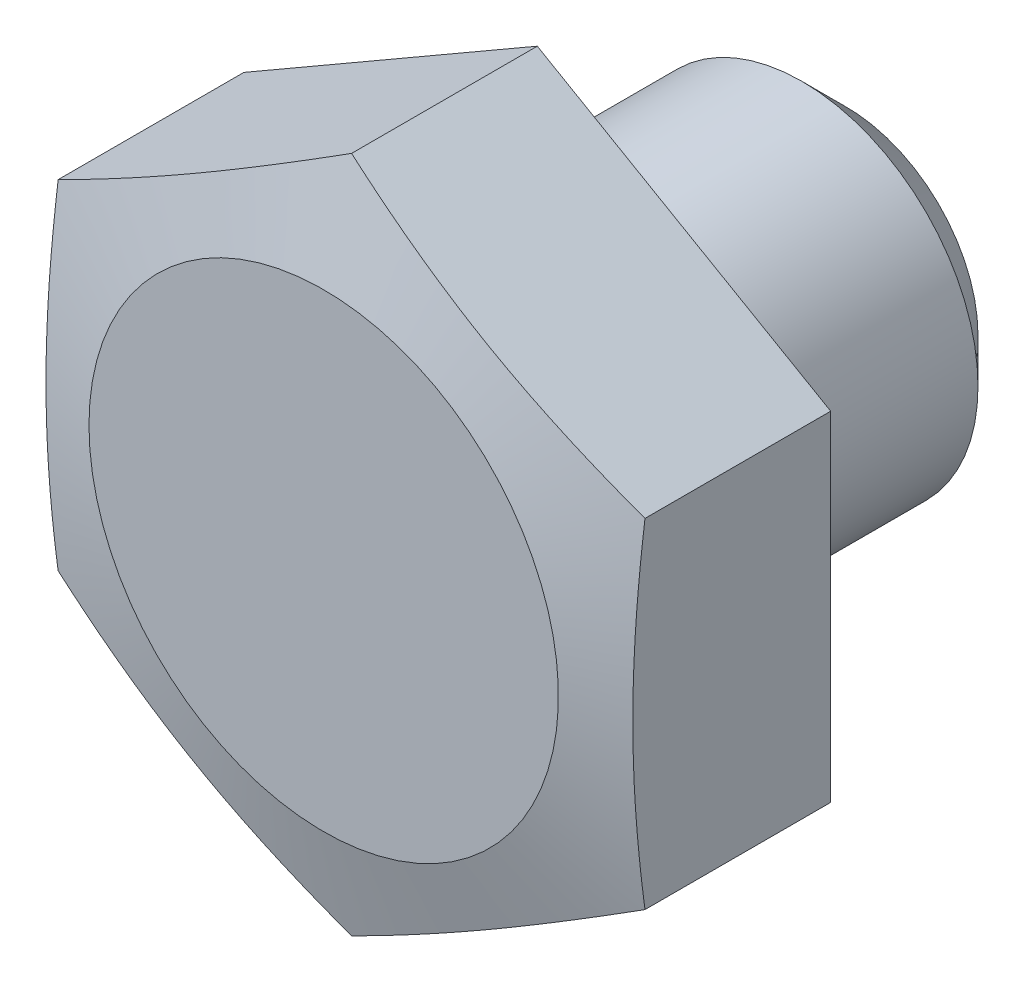
ISO-10303-21;
HEADER;
FILE_DESCRIPTION(('STEP AP214'),'2;1');
FILE_NAME('part.step','',(''),(''),'','','');
FILE_SCHEMA(('AUTOMOTIVE_DESIGN { 1 0 10303 214 1 1 1 1 }'));
ENDSEC;
DATA;
#1=APPLICATION_CONTEXT('core data for automotive mechanical design processes');
#2=APPLICATION_PROTOCOL_DEFINITION('international standard','automotive_design',2000,#1);
#3=PRODUCT_CONTEXT('',#1,'mechanical');
#4=PRODUCT('Part','Part','',(#3));
#5=PRODUCT_RELATED_PRODUCT_CATEGORY('part','',(#4));
#6=PRODUCT_DEFINITION_FORMATION('','',#4);
#7=PRODUCT_DEFINITION_CONTEXT('part definition',#1,'design');
#8=PRODUCT_DEFINITION('design','',#6,#7);
#9=PRODUCT_DEFINITION_SHAPE('','',#8);
#10=(LENGTH_UNIT() NAMED_UNIT(*) SI_UNIT(.MILLI.,.METRE.));
#11=(NAMED_UNIT(*) PLANE_ANGLE_UNIT() SI_UNIT($,.RADIAN.));
#12=(NAMED_UNIT(*) SI_UNIT($,.STERADIAN.) SOLID_ANGLE_UNIT());
#13=UNCERTAINTY_MEASURE_WITH_UNIT(LENGTH_MEASURE(1.E-05),#10,'distance_accuracy_value','');
#14=(GEOMETRIC_REPRESENTATION_CONTEXT(3) GLOBAL_UNCERTAINTY_ASSIGNED_CONTEXT((#13)) GLOBAL_UNIT_ASSIGNED_CONTEXT((#10,
#11,#12)) REPRESENTATION_CONTEXT('',''));
#15=CARTESIAN_POINT('',(0.,0.,0.));
#16=DIRECTION('',(0.,0.,1.));
#17=DIRECTION('',(1.,0.,0.));
#18=AXIS2_PLACEMENT_3D('',#15,#16,#17);
#19=CARTESIAN_POINT('',(0.,0.,0.));
#20=DIRECTION('',(0.,0.,1.));
#21=DIRECTION('',(1.,0.,0.));
#22=AXIS2_PLACEMENT_3D('',#19,#20,#21);
#23=PLANE('',#22);
#24=CARTESIAN_POINT('',(0.,0.,0.));
#25=DIRECTION('',(0.,0.,1.));
#26=DIRECTION('',(1.,0.,0.));
#27=AXIS2_PLACEMENT_3D('',#24,#25,#26);
#28=CIRCLE('',#27,3.1);
#29=CARTESIAN_POINT('',(3.1,0.,0.));
#30=VERTEX_POINT('',#29);
#31=EDGE_CURVE('E66',#30,#30,#28,.T.);
#32=ORIENTED_EDGE('',*,*,#31,.T.);
#33=EDGE_LOOP('',(#32));
#34=FACE_BOUND('',#33,.T.);
#35=CARTESIAN_POINT('',(0.,0.,0.));
#36=DIRECTION('',(0.,0.,1.));
#37=DIRECTION('',(1.,0.,0.));
#38=AXIS2_PLACEMENT_3D('',#35,#36,#37);
#39=CIRCLE('',#38,4.5);
#40=CARTESIAN_POINT('',(4.5,0.,0.));
#41=VERTEX_POINT('',#40);
#42=EDGE_CURVE('E362',#41,#41,#39,.T.);
#43=ORIENTED_EDGE('',*,*,#42,.F.);
#44=EDGE_LOOP('',(#43));
#45=FACE_BOUND('',#44,.T.);
#46=ADVANCED_FACE('F58',(#34,#45),#23,.F.);
#47=CARTESIAN_POINT('',(0.,0.,-5.));
#48=DIRECTION('',(0.,0.,1.));
#49=DIRECTION('',(1.,0.,0.));
#50=AXIS2_PLACEMENT_3D('',#47,#48,#49);
#51=CYLINDRICAL_SURFACE('',#50,3.);
#52=CARTESIAN_POINT('',(0.,0.,-0.1));
#53=DIRECTION('',(0.,0.,1.));
#54=DIRECTION('',(1.,0.,0.));
#55=AXIS2_PLACEMENT_3D('',#52,#53,#54);
#56=CIRCLE('',#55,3.);
#57=CARTESIAN_POINT('',(3.,0.,-0.1));
#58=VERTEX_POINT('',#57);
#59=EDGE_CURVE('E13',#58,#58,#56,.F.);
#60=ORIENTED_EDGE('',*,*,#59,.T.);
#61=EDGE_LOOP('',(#60));
#62=FACE_BOUND('',#61,.T.);
#63=CARTESIAN_POINT('',(0.,0.,-4.24999999999999));
#64=DIRECTION('',(0.,0.,1.));
#65=DIRECTION('',(1.,0.,0.));
#66=AXIS2_PLACEMENT_3D('',#63,#64,#65);
#67=CIRCLE('',#66,3.);
#68=CARTESIAN_POINT('',(3.,0.,-4.24999999999999));
#69=VERTEX_POINT('',#68);
#70=EDGE_CURVE('E147',#69,#69,#67,.T.);
#71=ORIENTED_EDGE('',*,*,#70,.T.);
#72=EDGE_LOOP('',(#71));
#73=FACE_BOUND('',#72,.T.);
#74=ADVANCED_FACE('F168',(#62,#73),#51,.T.);
#75=CARTESIAN_POINT('',(0.,0.,-5.));
#76=DIRECTION('',(0.,0.,1.));
#77=DIRECTION('',(1.,0.,0.));
#78=AXIS2_PLACEMENT_3D('',#75,#76,#77);
#79=PLANE('',#78);
#80=CARTESIAN_POINT('',(0.,0.,-5.));
#81=DIRECTION('',(0.,0.,1.));
#82=DIRECTION('',(1.,0.,0.));
#83=AXIS2_PLACEMENT_3D('',#80,#81,#82);
#84=CIRCLE('',#83,2.24999999999999);
#85=CARTESIAN_POINT('',(2.24999999999999,0.,-5.));
#86=VERTEX_POINT('',#85);
#87=EDGE_CURVE('E117',#86,#86,#84,.F.);
#88=ORIENTED_EDGE('',*,*,#87,.T.);
#89=EDGE_LOOP('',(#88));
#90=FACE_BOUND('',#89,.T.);
#91=ADVANCED_FACE('F173',(#90),#79,.F.);
#92=CARTESIAN_POINT('',(0.,0.,-4.24999999999999));
#93=DIRECTION('',(0.,0.,1.));
#94=DIRECTION('',(1.,0.,0.));
#95=AXIS2_PLACEMENT_3D('',#92,#93,#94);
#96=CONICAL_SURFACE('',#95,3.,0.785398163397454);
#97=ORIENTED_EDGE('',*,*,#87,.F.);
#98=EDGE_LOOP('',(#97));
#99=FACE_BOUND('',#98,.T.);
#100=ORIENTED_EDGE('',*,*,#70,.F.);
#101=EDGE_LOOP('',(#100));
#102=FACE_BOUND('',#101,.T.);
#103=ADVANCED_FACE('F241',(#99,#102),#96,.T.);
#104=CARTESIAN_POINT('',(0.,0.,0.26));
#105=DIRECTION('',(0.,0.,1.));
#106=DIRECTION('',(1.,0.,0.));
#107=AXIS2_PLACEMENT_3D('',#104,#105,#106);
#108=PLANE('',#107);
#109=CARTESIAN_POINT('',(0.,0.,0.26));
#110=DIRECTION('',(0.,0.,1.));
#111=DIRECTION('',(1.,0.,0.));
#112=AXIS2_PLACEMENT_3D('',#109,#110,#111);
#113=CIRCLE('',#112,4.5);
#114=CARTESIAN_POINT('',(4.5,0.,0.26));
#115=VERTEX_POINT('',#114);
#116=EDGE_CURVE('E127',#115,#115,#113,.T.);
#117=ORIENTED_EDGE('',*,*,#116,.T.);
#118=EDGE_LOOP('',(#117));
#119=FACE_BOUND('',#118,.T.);
#120=DIRECTION('',(0.,1.,0.));
#121=VECTOR('',#120,1.);
#122=CARTESIAN_POINT('',(5.,-2.88675134594813,0.26));
#123=LINE('',#122,#121);
#124=CARTESIAN_POINT('',(5.,-2.88675134594813,0.26));
#125=VERTEX_POINT('',#124);
#126=CARTESIAN_POINT('',(5.,2.88675134594813,0.26));
#127=VERTEX_POINT('',#126);
#128=EDGE_CURVE('E108',#125,#127,#123,.T.);
#129=ORIENTED_EDGE('',*,*,#128,.F.);
#130=DIRECTION('',(0.866025403784439,0.5,0.));
#131=VECTOR('',#130,1.);
#132=CARTESIAN_POINT('',(0.,-5.77350269189626,0.26));
#133=LINE('',#132,#131);
#134=CARTESIAN_POINT('',(0.,-5.77350269189626,0.26));
#135=VERTEX_POINT('',#134);
#136=EDGE_CURVE('E111',#135,#125,#133,.T.);
#137=ORIENTED_EDGE('',*,*,#136,.F.);
#138=DIRECTION('',(0.866025403784439,-0.5,0.));
#139=VECTOR('',#138,1.);
#140=CARTESIAN_POINT('',(-5.,-2.88675134594813,0.26));
#141=LINE('',#140,#139);
#142=CARTESIAN_POINT('',(-5.,-2.88675134594813,0.26));
#143=VERTEX_POINT('',#142);
#144=EDGE_CURVE('E126',#143,#135,#141,.T.);
#145=ORIENTED_EDGE('',*,*,#144,.F.);
#146=DIRECTION('',(0.,-1.,0.));
#147=VECTOR('',#146,1.);
#148=CARTESIAN_POINT('',(-5.,2.88675134594813,0.26));
#149=LINE('',#148,#147);
#150=CARTESIAN_POINT('',(-5.,2.88675134594813,0.26));
#151=VERTEX_POINT('',#150);
#152=EDGE_CURVE('E354',#151,#143,#149,.T.);
#153=ORIENTED_EDGE('',*,*,#152,.F.);
#154=DIRECTION('',(-0.866025403784439,-0.5,0.));
#155=VECTOR('',#154,1.);
#156=CARTESIAN_POINT('',(0.,5.77350269189626,0.26));
#157=LINE('',#156,#155);
#158=CARTESIAN_POINT('',(0.,5.77350269189626,0.26));
#159=VERTEX_POINT('',#158);
#160=EDGE_CURVE('E357',#159,#151,#157,.T.);
#161=ORIENTED_EDGE('',*,*,#160,.F.);
#162=DIRECTION('',(-0.866025403784439,0.5,0.));
#163=VECTOR('',#162,1.);
#164=CARTESIAN_POINT('',(5.,2.88675134594813,0.26));
#165=LINE('',#164,#163);
#166=EDGE_CURVE('E73',#127,#159,#165,.T.);
#167=ORIENTED_EDGE('',*,*,#166,.F.);
#168=EDGE_LOOP('',(#129,#137,#145,#153,#161,#167));
#169=FACE_BOUND('',#168,.T.);
#170=ADVANCED_FACE('F110',(#119,#169),#108,.F.);
#171=CARTESIAN_POINT('',(0.,0.,0.26));
#172=DIRECTION('',(0.,0.,-1.));
#173=DIRECTION('',(-1.,0.,0.));
#174=AXIS2_PLACEMENT_3D('',#171,#172,#173);
#175=CYLINDRICAL_SURFACE('',#174,4.5);
#176=ORIENTED_EDGE('',*,*,#116,.F.);
#177=EDGE_LOOP('',(#176));
#178=FACE_BOUND('',#177,.T.);
#179=ORIENTED_EDGE('',*,*,#42,.T.);
#180=EDGE_LOOP('',(#179));
#181=FACE_BOUND('',#180,.T.);
#182=ADVANCED_FACE('F248',(#178,#181),#175,.T.);
#183=CARTESIAN_POINT('',(0.,0.,3.9));
#184=DIRECTION('',(0.,0.,1.));
#185=DIRECTION('',(1.,0.,0.));
#186=AXIS2_PLACEMENT_3D('',#183,#184,#185);
#187=PLANE('',#186);
#188=CARTESIAN_POINT('',(0.,0.,3.9));
#189=DIRECTION('',(0.,0.,-1.));
#190=DIRECTION('',(-1.,0.,0.));
#191=AXIS2_PLACEMENT_3D('',#188,#189,#190);
#192=CIRCLE('',#191,4.);
#193=CARTESIAN_POINT('',(-4.,0.,3.9));
#194=VERTEX_POINT('',#193);
#195=EDGE_CURVE('E193',#194,#194,#192,.T.);
#196=ORIENTED_EDGE('',*,*,#195,.F.);
#197=EDGE_LOOP('',(#196));
#198=FACE_BOUND('',#197,.T.);
#199=ADVANCED_FACE('F178',(#198),#187,.T.);
#200=CARTESIAN_POINT('',(0.,0.,3.9));
#201=DIRECTION('',(0.,0.,-1.));
#202=DIRECTION('',(-1.,0.,0.));
#203=AXIS2_PLACEMENT_3D('',#200,#201,#202);
#204=CONICAL_SURFACE('',#203,4.,1.30899693899575);
#205=ORIENTED_EDGE('',*,*,#195,.T.);
#206=EDGE_LOOP('',(#205));
#207=FACE_BOUND('',#206,.T.);
#208=CARTESIAN_POINT('',(-5.0002,2.88663587589429,3.42476044489613));
#209=CARTESIAN_POINT('',(-4.79254599569434,3.00652497117847,3.45689871138588));
#210=CARTESIAN_POINT('',(-4.58451548167429,3.1266314444476,3.48607499454545));
#211=CARTESIAN_POINT('',(-4.16771975103018,3.36726857173206,3.53733503738883));
#212=CARTESIAN_POINT('',(-3.95895427067026,3.48779937801537,3.55941591599972));
#213=CARTESIAN_POINT('',(-3.54195440146031,3.72855436475577,3.59519603972269));
#214=CARTESIAN_POINT('',(-3.33372283258692,3.8487769170986,3.6089379557021));
#215=CARTESIAN_POINT('',(-2.91699413634292,4.08937534205412,3.62736446336494));
#216=CARTESIAN_POINT('',(-2.70849706817146,4.20975118048816,3.63205080756888));
#217=CARTESIAN_POINT('',(-2.29150293182854,4.45050285735623,3.63205080756888));
#218=CARTESIAN_POINT('',(-2.08300586365708,4.57087869579027,3.62736446336494));
#219=CARTESIAN_POINT('',(-1.66627716741308,4.81147712074579,3.6089379557021));
#220=CARTESIAN_POINT('',(-1.45804559853969,4.93169967308862,3.59519603972269));
#221=CARTESIAN_POINT('',(-1.04104572932974,5.17245465982902,3.55941591599972));
#222=CARTESIAN_POINT('',(-0.832280248969818,5.29298546611233,3.53733503738883));
#223=CARTESIAN_POINT('',(-0.415484518325708,5.53362259339679,3.48607499454545));
#224=CARTESIAN_POINT('',(-0.207454004305664,5.65372906666592,3.45689871138588));
#225=CARTESIAN_POINT('',(0.000200000000000952,5.7736181619501,3.42476044489613));
#226=B_SPLINE_CURVE_WITH_KNOTS('',3,(#208,#209,#210,#211,#212,#213,#214,#215,#216,#217,#218,
#219,#220,#221,#222,#223,#224,#225),.UNSPECIFIED.,.F.,.F.,(4,2,2,2,2,2,2,2,4),(0.,
0.725805237679808,1.45190481561532,2.17425686883392,2.89646911159516,3.6186813543564,
4.34103340757501,5.06713298551051,5.79293822319032),.UNSPECIFIED.);
#227=CARTESIAN_POINT('',(-5.,2.88675134594813,3.42479138593199));
#228=VERTEX_POINT('',#227);
#229=CARTESIAN_POINT('',(0.,5.77350269189626,3.42479138593199));
#230=VERTEX_POINT('',#229);
#231=EDGE_CURVE('E224',#228,#230,#226,.T.);
#232=ORIENTED_EDGE('',*,*,#231,.F.);
#233=CARTESIAN_POINT('',(-5.,-7.71938857293575,2.50740758007849));
#234=CARTESIAN_POINT('',(-5.,-7.49147427168933,2.5586506711407));
#235=CARTESIAN_POINT('',(-5.,-7.26341962327938,2.60928049818289));
#236=CARTESIAN_POINT('',(-5.,-6.80696046487182,2.70898221683248));
#237=CARTESIAN_POINT('',(-5.,-6.57855594068918,2.75805404342194));
#238=CARTESIAN_POINT('',(-5.,-6.12114081846093,2.85434740009249));
#239=CARTESIAN_POINT('',(-5.,-5.89212985971082,2.9015672227117));
#240=CARTESIAN_POINT('',(-5.,-5.43363694023774,2.99366077539556));
#241=CARTESIAN_POINT('',(-5.,-5.20415498336043,3.03853452453708));
#242=CARTESIAN_POINT('',(-5.,-4.74669561473332,3.12498601768013));
#243=CARTESIAN_POINT('',(-5.,-4.51872312275535,3.16658966965695));
#244=CARTESIAN_POINT('',(-5.,-4.06216118292291,3.24625518987446));
#245=CARTESIAN_POINT('',(-5.,-3.83357174836871,3.28431713385075));
#246=CARTESIAN_POINT('',(-5.,-3.37571675111581,3.35606117758773));
#247=CARTESIAN_POINT('',(-5.,-3.14645123580777,3.38974357720939));
#248=CARTESIAN_POINT('',(-5.,-2.68718848722816,3.45175097196975));
#249=CARTESIAN_POINT('',(-5.,-2.45719125269116,3.48007595783829));
#250=CARTESIAN_POINT('',(-5.,-1.99381235919122,3.53058841201233));
#251=CARTESIAN_POINT('',(-5.,-1.76042239852366,3.55270084172098));
#252=CARTESIAN_POINT('',(-5.,-1.29303834898082,3.58927121142274));
#253=CARTESIAN_POINT('',(-5.,-1.05904427428246,3.60372932943009));
#254=CARTESIAN_POINT('',(-5.,-0.590803464055625,3.62414927679565));
#255=CARTESIAN_POINT('',(-5.,-0.356556930570833,3.63011564576264));
#256=CARTESIAN_POINT('',(-5.,0.1119950018632,3.63318477990246));
#257=CARTESIAN_POINT('',(-5.,0.346300400708154,3.63028756066898));
#258=CARTESIAN_POINT('',(-5.,0.815702332550344,3.6157848044719));
#259=CARTESIAN_POINT('',(-5.,1.05079761908674,3.60413973435184));
#260=CARTESIAN_POINT('',(-5.,1.52045390424001,3.57280431062971));
#261=CARTESIAN_POINT('',(-5.,1.7550148730958,3.55311351939736));
#262=CARTESIAN_POINT('',(-5.,2.22359969488492,3.50670213839425));
#263=CARTESIAN_POINT('',(-5.,2.45762304038479,3.47997650447177));
#264=CARTESIAN_POINT('',(-5.,2.92491072170449,3.42063342174126));
#265=CARTESIAN_POINT('',(-5.,3.15817506053191,3.38801599630868));
#266=CARTESIAN_POINT('',(-5.,3.67089843043664,3.31090516163662));
#267=CARTESIAN_POINT('',(-5.,3.95019552214342,3.2653430589873));
#268=CARTESIAN_POINT('',(-5.,4.5078641671335,3.16884457136917));
#269=CARTESIAN_POINT('',(-5.,4.78623567003497,3.11790789863514));
#270=CARTESIAN_POINT('',(-5.,5.34224429024145,3.01189120228595));
#271=CARTESIAN_POINT('',(-5.,5.61988124068023,2.95681030902665));
#272=CARTESIAN_POINT('',(-5.,6.1744943954023,2.84345950223111));
#273=CARTESIAN_POINT('',(-5.,6.4514706124489,2.78518965082479));
#274=CARTESIAN_POINT('',(-5.,7.0050486624742,2.66613430078371));
#275=CARTESIAN_POINT('',(-5.,7.28165018383369,2.60534735809867));
#276=CARTESIAN_POINT('',(-5.,7.83441649328104,2.4818160373549));
#277=CARTESIAN_POINT('',(-5.,8.11058127842605,2.41907164616488));
#278=CARTESIAN_POINT('',(-5.,8.93847178761893,2.2285435952327));
#279=CARTESIAN_POINT('',(-5.,9.48966522946674,2.09844942786497));
#280=CARTESIAN_POINT('',(-5.,10.5827319287434,1.83626115900039));
#281=CARTESIAN_POINT('',(-5.,11.1246197407943,1.70422732451607));
#282=CARTESIAN_POINT('',(-5.,12.2077528662115,1.43746864765053));
#283=CARTESIAN_POINT('',(-5.,12.7489981551808,1.30274370634371));
#284=CARTESIAN_POINT('',(-5.,13.8299959758578,1.03164505898908));
#285=CARTESIAN_POINT('',(-5.,14.3697494036634,0.895274918043513));
#286=CARTESIAN_POINT('',(-5.,15.4488678627502,0.621114449919813));
#287=CARTESIAN_POINT('',(-5.,15.9882329115673,0.483324191805858));
#288=CARTESIAN_POINT('',(-5.,16.5274739773435,0.34505516170082));
#289=B_SPLINE_CURVE_WITH_KNOTS('',3,(#233,#234,#235,#236,#237,#238,#239,#240,#241,#242,#243,
#244,#245,#246,#247,#248,#249,#250,#251,#252,#253,#254,#255,#256,#257,#258,#259,#260,#261,#262,
#263,#264,#265,#266,#267,#268,#269,#270,#271,#272,#273,#274,#275,#276,#277,#278,#279,#280,#281,
#282,#283,#284,#285,#286,#287,#288),.UNSPECIFIED.,.F.,.F.,(4,2,2,2,2,2,2,2,2,2,2,2,2,2,2,2,2,2,
2,2,2,2,2,2,2,2,2,4),(0.,0.700814460777488,1.40165812936402,2.10313344179458,2.80460304935615,
3.49979359532529,4.19496927197792,4.89009732587981,5.58522658257885,6.28842261062312,
6.99160228390911,7.6944059026078,8.39720828486562,9.10320601298499,9.80924214749582,
10.5157859125011,11.2223268743828,12.0712227288488,12.9201640579817,13.7692840327893,
14.6183874702216,15.4679849751964,16.3175881808191,18.0165748535255,19.6897908742068,
21.3630685162348,23.0332087424935,24.7032681249786),.UNSPECIFIED.);
#290=CARTESIAN_POINT('',(-5.,-2.88675134594813,3.42479138593199));
#291=VERTEX_POINT('',#290);
#292=EDGE_CURVE('E217',#291,#228,#289,.T.);
#293=ORIENTED_EDGE('',*,*,#292,.F.);
#294=CARTESIAN_POINT('',(0.000200000000000598,-5.7736181619501,3.42476044489613));
#295=CARTESIAN_POINT('',(-0.207454004305664,-5.65372906666592,3.45689871138588));
#296=CARTESIAN_POINT('',(-0.415484518325707,-5.53362259339679,3.48607499454545));
#297=CARTESIAN_POINT('',(-0.832280248969817,-5.29298546611233,3.53733503738883));
#298=CARTESIAN_POINT('',(-1.04104572932974,-5.17245465982902,3.55941591599972));
#299=CARTESIAN_POINT('',(-1.45804559853969,-4.93169967308862,3.59519603972269));
#300=CARTESIAN_POINT('',(-1.66627716741308,-4.81147712074579,3.6089379557021));
#301=CARTESIAN_POINT('',(-2.08300586365708,-4.57087869579027,3.62736446336494));
#302=CARTESIAN_POINT('',(-2.29150293182854,-4.45050285735623,3.63205080756888));
#303=CARTESIAN_POINT('',(-2.70849706817146,-4.20975118048815,3.63205080756888));
#304=CARTESIAN_POINT('',(-2.91699413634292,-4.08937534205412,3.62736446336494));
#305=CARTESIAN_POINT('',(-3.33372283258692,-3.8487769170986,3.6089379557021));
#306=CARTESIAN_POINT('',(-3.54195440146031,-3.72855436475577,3.59519603972269));
#307=CARTESIAN_POINT('',(-3.95895427067026,-3.48779937801536,3.55941591599972));
#308=CARTESIAN_POINT('',(-4.16771975103018,-3.36726857173206,3.53733503738883));
#309=CARTESIAN_POINT('',(-4.58451548167429,-3.1266314444476,3.48607499454545));
#310=CARTESIAN_POINT('',(-4.79254599569433,-3.00652497117847,3.45689871138588));
#311=CARTESIAN_POINT('',(-5.0002,-2.88663587589429,3.42476044489613));
#312=B_SPLINE_CURVE_WITH_KNOTS('',3,(#294,#295,#296,#297,#298,#299,#300,#301,#302,#303,#304,
#305,#306,#307,#308,#309,#310,#311),.UNSPECIFIED.,.F.,.F.,(4,2,2,2,2,2,2,2,4),(0.,
0.725805237679808,1.45190481561532,2.17425686883392,2.89646911159516,3.6186813543564,
4.34103340757501,5.06713298551051,5.79293822319032),.UNSPECIFIED.);
#313=CARTESIAN_POINT('',(0.,-5.77350269189626,3.42479138593199));
#314=VERTEX_POINT('',#313);
#315=EDGE_CURVE('E211',#314,#291,#312,.T.);
#316=ORIENTED_EDGE('',*,*,#315,.F.);
#317=CARTESIAN_POINT('',(5.0002,-2.88663587589429,3.42476044489613));
#318=CARTESIAN_POINT('',(4.79254599569433,-3.00652497117847,3.45689871138588));
#319=CARTESIAN_POINT('',(4.58451548167429,-3.1266314444476,3.48607499454545));
#320=CARTESIAN_POINT('',(4.16771975103018,-3.36726857173207,3.53733503738883));
#321=CARTESIAN_POINT('',(3.95895427067026,-3.48779937801537,3.55941591599972));
#322=CARTESIAN_POINT('',(3.54195440146031,-3.72855436475577,3.59519603972269));
#323=CARTESIAN_POINT('',(3.33372283258692,-3.8487769170986,3.6089379557021));
#324=CARTESIAN_POINT('',(2.91699413634291,-4.08937534205412,3.62736446336494));
#325=CARTESIAN_POINT('',(2.70849706817146,-4.20975118048816,3.63205080756888));
#326=CARTESIAN_POINT('',(2.29150293182854,-4.45050285735624,3.63205080756888));
#327=CARTESIAN_POINT('',(2.08300586365709,-4.57087869579027,3.62736446336494));
#328=CARTESIAN_POINT('',(1.66627716741308,-4.81147712074579,3.6089379557021));
#329=CARTESIAN_POINT('',(1.45804559853969,-4.93169967308862,3.59519603972269));
#330=CARTESIAN_POINT('',(1.04104572932974,-5.17245465982903,3.55941591599972));
#331=CARTESIAN_POINT('',(0.832280248969819,-5.29298546611233,3.53733503738883));
#332=CARTESIAN_POINT('',(0.415484518325708,-5.53362259339679,3.48607499454545));
#333=CARTESIAN_POINT('',(0.207454004305665,-5.65372906666592,3.45689871138588));
#334=CARTESIAN_POINT('',(-0.000199999999999693,-5.7736181619501,3.42476044489613));
#335=B_SPLINE_CURVE_WITH_KNOTS('',3,(#317,#318,#319,#320,#321,#322,#323,#324,#325,#326,#327,
#328,#329,#330,#331,#332,#333,#334),.UNSPECIFIED.,.F.,.F.,(4,2,2,2,2,2,2,2,4),(0.,
0.725805237679808,1.45190481561532,2.17425686883392,2.89646911159516,3.6186813543564,
4.341033407575,5.06713298551051,5.79293822319032),.UNSPECIFIED.);
#336=CARTESIAN_POINT('',(5.,-2.88675134594813,3.42479138593199));
#337=VERTEX_POINT('',#336);
#338=EDGE_CURVE('E81',#337,#314,#335,.T.);
#339=ORIENTED_EDGE('',*,*,#338,.F.);
#340=CARTESIAN_POINT('',(5.,-7.71938857293575,2.50740758007849));
#341=CARTESIAN_POINT('',(5.,-7.49147427168934,2.5586506711407));
#342=CARTESIAN_POINT('',(5.,-7.26341962327938,2.60928049818289));
#343=CARTESIAN_POINT('',(5.,-6.80696046487183,2.70898221683248));
#344=CARTESIAN_POINT('',(5.,-6.57855594068919,2.75805404342194));
#345=CARTESIAN_POINT('',(5.,-6.12114081846093,2.85434740009249));
#346=CARTESIAN_POINT('',(5.,-5.89212985971083,2.9015672227117));
#347=CARTESIAN_POINT('',(5.,-5.43363694023775,2.99366077539556));
#348=CARTESIAN_POINT('',(5.,-5.20415498336043,3.03853452453708));
#349=CARTESIAN_POINT('',(5.,-4.74669561473333,3.12498601768013));
#350=CARTESIAN_POINT('',(5.,-4.51872312275535,3.16658966965695));
#351=CARTESIAN_POINT('',(5.,-4.06216118292291,3.24625518987446));
#352=CARTESIAN_POINT('',(5.,-3.83357174836871,3.28431713385075));
#353=CARTESIAN_POINT('',(5.,-3.37571675111582,3.35606117758773));
#354=CARTESIAN_POINT('',(5.,-3.14645123580777,3.38974357720939));
#355=CARTESIAN_POINT('',(5.,-2.68718848722816,3.45175097196975));
#356=CARTESIAN_POINT('',(5.,-2.45719125269117,3.48007595783829));
#357=CARTESIAN_POINT('',(5.,-1.99381235919123,3.53058841201233));
#358=CARTESIAN_POINT('',(5.,-1.76042239852366,3.55270084172098));
#359=CARTESIAN_POINT('',(5.,-1.29303834898083,3.58927121142274));
#360=CARTESIAN_POINT('',(5.,-1.05904427428246,3.6037293294301));
#361=CARTESIAN_POINT('',(5.,-0.59080346405563,3.62414927679565));
#362=CARTESIAN_POINT('',(5.,-0.356556930570837,3.63011564576264));
#363=CARTESIAN_POINT('',(5.,0.111995001863196,3.63318477990246));
#364=CARTESIAN_POINT('',(5.,0.34630040070815,3.63028756066898));
#365=CARTESIAN_POINT('',(5.,0.81570233255034,3.6157848044719));
#366=CARTESIAN_POINT('',(5.,1.05079761908674,3.60413973435184));
#367=CARTESIAN_POINT('',(5.,1.52045390424001,3.57280431062971));
#368=CARTESIAN_POINT('',(5.,1.75501487309579,3.55311351939736));
#369=CARTESIAN_POINT('',(5.,2.22359969488492,3.50670213839425));
#370=CARTESIAN_POINT('',(5.,2.45762304038479,3.47997650447177));
#371=CARTESIAN_POINT('',(5.,2.92491072170449,3.42063342174126));
#372=CARTESIAN_POINT('',(5.,3.15817506053191,3.38801599630868));
#373=CARTESIAN_POINT('',(5.,3.67089843043664,3.31090516163663));
#374=CARTESIAN_POINT('',(5.,3.95019552214341,3.2653430589873));
#375=CARTESIAN_POINT('',(5.,4.5078641671335,3.16884457136917));
#376=CARTESIAN_POINT('',(5.,4.78623567003497,3.11790789863514));
#377=CARTESIAN_POINT('',(5.,5.34224429024145,3.01189120228595));
#378=CARTESIAN_POINT('',(5.,5.61988124068023,2.95681030902665));
#379=CARTESIAN_POINT('',(5.,6.17449439540229,2.84345950223111));
#380=CARTESIAN_POINT('',(5.,6.45147061244889,2.78518965082479));
#381=CARTESIAN_POINT('',(5.,7.0050486624742,2.66613430078371));
#382=CARTESIAN_POINT('',(5.,7.28165018383368,2.60534735809867));
#383=CARTESIAN_POINT('',(5.,7.83441649328104,2.48181603735491));
#384=CARTESIAN_POINT('',(5.,8.11058127842605,2.41907164616488));
#385=CARTESIAN_POINT('',(5.,8.93847178761892,2.2285435952327));
#386=CARTESIAN_POINT('',(5.,9.48966522946674,2.09844942786497));
#387=CARTESIAN_POINT('',(5.,10.5827319287434,1.83626115900039));
#388=CARTESIAN_POINT('',(5.,11.1246197407943,1.70422732451607));
#389=CARTESIAN_POINT('',(5.,12.2077528662115,1.43746864765053));
#390=CARTESIAN_POINT('',(5.,12.7489981551808,1.30274370634371));
#391=CARTESIAN_POINT('',(5.,13.8299959758578,1.03164505898908));
#392=CARTESIAN_POINT('',(5.,14.3697494036634,0.895274918043512));
#393=CARTESIAN_POINT('',(5.,15.4488678627503,0.621114449919811));
#394=CARTESIAN_POINT('',(5.,15.9882329115673,0.483324191805856));
#395=CARTESIAN_POINT('',(5.,16.5274739773435,0.345055161700819));
#396=B_SPLINE_CURVE_WITH_KNOTS('',3,(#340,#341,#342,#343,#344,#345,#346,#347,#348,#349,#350,
#351,#352,#353,#354,#355,#356,#357,#358,#359,#360,#361,#362,#363,#364,#365,#366,#367,#368,#369,
#370,#371,#372,#373,#374,#375,#376,#377,#378,#379,#380,#381,#382,#383,#384,#385,#386,#387,#388,
#389,#390,#391,#392,#393,#394,#395),.UNSPECIFIED.,.F.,.F.,(4,2,2,2,2,2,2,2,2,2,2,2,2,2,2,2,2,2,
2,2,2,2,2,2,2,2,2,4),(0.,0.700814460777487,1.40165812936402,2.10313344179458,2.80460304935614,
3.49979359532529,4.19496927197792,4.89009732587981,5.58522658257885,6.28842261062312,
6.99160228390911,7.6944059026078,8.39720828486562,9.10320601298499,9.80924214749582,
10.5157859125011,11.2223268743828,12.0712227288488,12.9201640579817,13.7692840327893,
14.6183874702216,15.4679849751964,16.3175881808191,18.0165748535255,19.6897908742068,
21.3630685162348,23.0332087424935,24.7032681249786),.UNSPECIFIED.);
#397=CARTESIAN_POINT('',(5.,2.88675134594813,3.42479138593199));
#398=VERTEX_POINT('',#397);
#399=EDGE_CURVE('E130',#398,#337,#396,.F.);
#400=ORIENTED_EDGE('',*,*,#399,.F.);
#401=CARTESIAN_POINT('',(-0.000199999999999493,5.7736181619501,3.42476044489613));
#402=CARTESIAN_POINT('',(0.207454004305665,5.65372906666592,3.45689871138588));
#403=CARTESIAN_POINT('',(0.415484518325708,5.53362259339679,3.48607499454545));
#404=CARTESIAN_POINT('',(0.832280248969819,5.29298546611233,3.53733503738883));
#405=CARTESIAN_POINT('',(1.04104572932974,5.17245465982903,3.55941591599972));
#406=CARTESIAN_POINT('',(1.45804559853969,4.93169967308862,3.59519603972269));
#407=CARTESIAN_POINT('',(1.66627716741308,4.81147712074579,3.6089379557021));
#408=CARTESIAN_POINT('',(2.08300586365709,4.57087869579027,3.62736446336494));
#409=CARTESIAN_POINT('',(2.29150293182854,4.45050285735623,3.63205080756888));
#410=CARTESIAN_POINT('',(2.70849706817146,4.20975118048816,3.63205080756888));
#411=CARTESIAN_POINT('',(2.91699413634291,4.08937534205412,3.62736446336494));
#412=CARTESIAN_POINT('',(3.33372283258692,3.8487769170986,3.6089379557021));
#413=CARTESIAN_POINT('',(3.54195440146031,3.72855436475577,3.59519603972269));
#414=CARTESIAN_POINT('',(3.95895427067026,3.48779937801536,3.55941591599972));
#415=CARTESIAN_POINT('',(4.16771975103018,3.36726857173206,3.53733503738883));
#416=CARTESIAN_POINT('',(4.58451548167429,3.1266314444476,3.48607499454545));
#417=CARTESIAN_POINT('',(4.79254599569433,3.00652497117847,3.45689871138588));
#418=CARTESIAN_POINT('',(5.0002,2.88663587589429,3.42476044489613));
#419=B_SPLINE_CURVE_WITH_KNOTS('',3,(#401,#402,#403,#404,#405,#406,#407,#408,#409,#410,#411,
#412,#413,#414,#415,#416,#417,#418),.UNSPECIFIED.,.F.,.F.,(4,2,2,2,2,2,2,2,4),(0.,
0.725805237679807,1.45190481561531,2.17425686883392,2.89646911159516,3.6186813543564,
4.341033407575,5.06713298551051,5.79293822319032),.UNSPECIFIED.);
#420=EDGE_CURVE('E135',#230,#398,#419,.T.);
#421=ORIENTED_EDGE('',*,*,#420,.F.);
#422=EDGE_LOOP('',(#232,#293,#316,#339,#400,#421));
#423=FACE_BOUND('',#422,.T.);
#424=ADVANCED_FACE('F182',(#207,#423),#204,.T.);
#425=CARTESIAN_POINT('',(5.,-2.88675134594813,3.9));
#426=DIRECTION('',(-1.,0.,0.));
#427=DIRECTION('',(0.,0.,1.));
#428=AXIS2_PLACEMENT_3D('',#425,#426,#427);
#429=PLANE('',#428);
#430=DIRECTION('',(0.,0.,-1.));
#431=VECTOR('',#430,1.);
#432=CARTESIAN_POINT('',(5.,-2.88675134594813,3.9));
#433=LINE('',#432,#431);
#434=EDGE_CURVE('E123',#337,#125,#433,.T.);
#435=ORIENTED_EDGE('',*,*,#434,.T.);
#436=ORIENTED_EDGE('',*,*,#128,.T.);
#437=DIRECTION('',(0.,0.,-1.));
#438=VECTOR('',#437,1.);
#439=CARTESIAN_POINT('',(5.,2.88675134594813,3.9));
#440=LINE('',#439,#438);
#441=EDGE_CURVE('E131',#398,#127,#440,.T.);
#442=ORIENTED_EDGE('',*,*,#441,.F.);
#443=ORIENTED_EDGE('',*,*,#399,.T.);
#444=EDGE_LOOP('',(#435,#436,#442,#443));
#445=FACE_BOUND('',#444,.T.);
#446=ADVANCED_FACE('F129',(#445),#429,.F.);
#447=CARTESIAN_POINT('',(0.,-5.77350269189626,3.9));
#448=DIRECTION('',(-0.5,0.866025403784439,0.));
#449=DIRECTION('',(-0.866025403784439,-0.5,0.));
#450=AXIS2_PLACEMENT_3D('',#447,#448,#449);
#451=PLANE('',#450);
#452=DIRECTION('',(0.,0.,-1.));
#453=VECTOR('',#452,1.);
#454=CARTESIAN_POINT('',(0.,-5.77350269189626,3.9));
#455=LINE('',#454,#453);
#456=EDGE_CURVE('E125',#314,#135,#455,.T.);
#457=ORIENTED_EDGE('',*,*,#456,.T.);
#458=ORIENTED_EDGE('',*,*,#136,.T.);
#459=ORIENTED_EDGE('',*,*,#434,.F.);
#460=ORIENTED_EDGE('',*,*,#338,.T.);
#461=EDGE_LOOP('',(#457,#458,#459,#460));
#462=FACE_BOUND('',#461,.T.);
#463=ADVANCED_FACE('F122',(#462),#451,.F.);
#464=CARTESIAN_POINT('',(-5.,-2.88675134594813,3.9));
#465=DIRECTION('',(0.5,0.866025403784439,0.));
#466=DIRECTION('',(-0.866025403784439,0.5,0.));
#467=AXIS2_PLACEMENT_3D('',#464,#465,#466);
#468=PLANE('',#467);
#469=DIRECTION('',(0.,0.,-1.));
#470=VECTOR('',#469,1.);
#471=CARTESIAN_POINT('',(-5.,-2.88675134594813,3.9));
#472=LINE('',#471,#470);
#473=EDGE_CURVE('E133',#291,#143,#472,.T.);
#474=ORIENTED_EDGE('',*,*,#473,.T.);
#475=ORIENTED_EDGE('',*,*,#144,.T.);
#476=ORIENTED_EDGE('',*,*,#456,.F.);
#477=ORIENTED_EDGE('',*,*,#315,.T.);
#478=EDGE_LOOP('',(#474,#475,#476,#477));
#479=FACE_BOUND('',#478,.T.);
#480=ADVANCED_FACE('F305',(#479),#468,.F.);
#481=CARTESIAN_POINT('',(-5.,2.88675134594813,3.9));
#482=DIRECTION('',(1.,0.,0.));
#483=DIRECTION('',(0.,1.,0.));
#484=AXIS2_PLACEMENT_3D('',#481,#482,#483);
#485=PLANE('',#484);
#486=DIRECTION('',(0.,0.,-1.));
#487=VECTOR('',#486,1.);
#488=CARTESIAN_POINT('',(-5.,2.88675134594813,3.9));
#489=LINE('',#488,#487);
#490=EDGE_CURVE('E141',#228,#151,#489,.T.);
#491=ORIENTED_EDGE('',*,*,#490,.T.);
#492=ORIENTED_EDGE('',*,*,#152,.T.);
#493=ORIENTED_EDGE('',*,*,#473,.F.);
#494=ORIENTED_EDGE('',*,*,#292,.T.);
#495=EDGE_LOOP('',(#491,#492,#493,#494));
#496=FACE_BOUND('',#495,.T.);
#497=ADVANCED_FACE('F237',(#496),#485,.F.);
#498=CARTESIAN_POINT('',(0.,5.77350269189626,3.9));
#499=DIRECTION('',(0.5,-0.866025403784439,0.));
#500=DIRECTION('',(0.866025403784439,0.5,0.));
#501=AXIS2_PLACEMENT_3D('',#498,#499,#500);
#502=PLANE('',#501);
#503=DIRECTION('',(0.,0.,-1.));
#504=VECTOR('',#503,1.);
#505=CARTESIAN_POINT('',(0.,5.77350269189626,3.9));
#506=LINE('',#505,#504);
#507=EDGE_CURVE('E144',#230,#159,#506,.T.);
#508=ORIENTED_EDGE('',*,*,#507,.T.);
#509=ORIENTED_EDGE('',*,*,#160,.T.);
#510=ORIENTED_EDGE('',*,*,#490,.F.);
#511=ORIENTED_EDGE('',*,*,#231,.T.);
#512=EDGE_LOOP('',(#508,#509,#510,#511));
#513=FACE_BOUND('',#512,.T.);
#514=ADVANCED_FACE('F163',(#513),#502,.F.);
#515=CARTESIAN_POINT('',(5.,2.88675134594813,3.9));
#516=DIRECTION('',(-0.5,-0.866025403784438,0.));
#517=DIRECTION('',(0.866025403784439,-0.5,0.));
#518=AXIS2_PLACEMENT_3D('',#515,#516,#517);
#519=PLANE('',#518);
#520=ORIENTED_EDGE('',*,*,#441,.T.);
#521=ORIENTED_EDGE('',*,*,#166,.T.);
#522=ORIENTED_EDGE('',*,*,#507,.F.);
#523=ORIENTED_EDGE('',*,*,#420,.T.);
#524=EDGE_LOOP('',(#520,#521,#522,#523));
#525=FACE_BOUND('',#524,.T.);
#526=ADVANCED_FACE('F157',(#525),#519,.F.);
#527=CARTESIAN_POINT('',(0.,0.,-0.1));
#528=DIRECTION('',(0.,0.,1.));
#529=DIRECTION('',(1.,0.,0.));
#530=AXIS2_PLACEMENT_3D('',#527,#528,#529);
#531=TOROIDAL_SURFACE('',#530,3.1,0.1);
#532=ORIENTED_EDGE('',*,*,#59,.F.);
#533=EDGE_LOOP('',(#532));
#534=FACE_BOUND('',#533,.T.);
#535=ORIENTED_EDGE('',*,*,#31,.F.);
#536=EDGE_LOOP('',(#535));
#537=FACE_BOUND('',#536,.T.);
#538=ADVANCED_FACE('F60',(#534,#537),#531,.F.);
#539=CLOSED_SHELL('',(#46,#74,#91,#103,#170,#182,#199,#424,#446,#463,#480,#497,#514,#526,#538));
#540=MANIFOLD_SOLID_BREP('B2',#539);
#541=ADVANCED_BREP_SHAPE_REPRESENTATION('',(#18,#540),#14);
#542=SHAPE_DEFINITION_REPRESENTATION(#9,#541);
ENDSEC;
END-ISO-10303-21;
